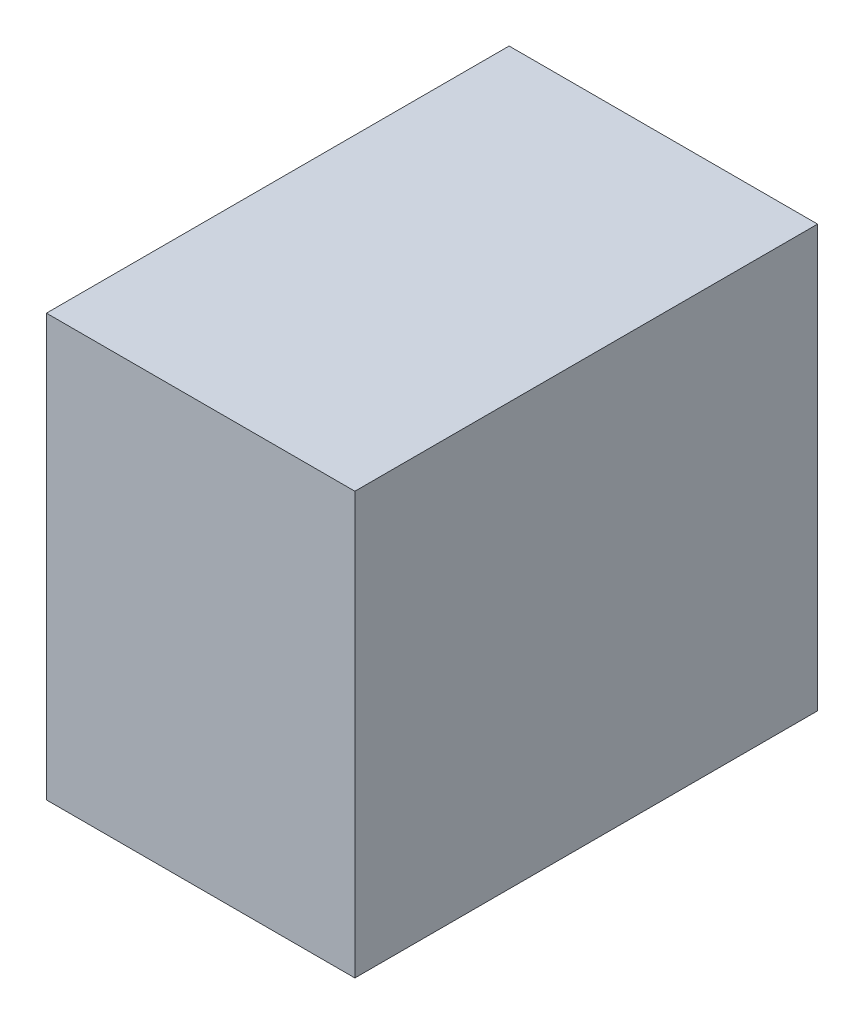
ISO-10303-21;
HEADER;
FILE_DESCRIPTION(('STEP AP214'),'2;1');
FILE_NAME('part.step','',(''),(''),'','','');
FILE_SCHEMA(('AUTOMOTIVE_DESIGN { 1 0 10303 214 1 1 1 1 }'));
ENDSEC;
DATA;
#1=APPLICATION_CONTEXT('core data for automotive mechanical design processes');
#2=APPLICATION_PROTOCOL_DEFINITION('international standard','automotive_design',2000,#1);
#3=PRODUCT_CONTEXT('',#1,'mechanical');
#4=PRODUCT('Part','Part','',(#3));
#5=PRODUCT_RELATED_PRODUCT_CATEGORY('part','',(#4));
#6=PRODUCT_DEFINITION_FORMATION('','',#4);
#7=PRODUCT_DEFINITION_CONTEXT('part definition',#1,'design');
#8=PRODUCT_DEFINITION('design','',#6,#7);
#9=PRODUCT_DEFINITION_SHAPE('','',#8);
#10=(LENGTH_UNIT() NAMED_UNIT(*) SI_UNIT(.MILLI.,.METRE.));
#11=(NAMED_UNIT(*) PLANE_ANGLE_UNIT() SI_UNIT($,.RADIAN.));
#12=(NAMED_UNIT(*) SI_UNIT($,.STERADIAN.) SOLID_ANGLE_UNIT());
#13=UNCERTAINTY_MEASURE_WITH_UNIT(LENGTH_MEASURE(1.E-05),#10,'distance_accuracy_value','');
#14=(GEOMETRIC_REPRESENTATION_CONTEXT(3) GLOBAL_UNCERTAINTY_ASSIGNED_CONTEXT((#13)) GLOBAL_UNIT_ASSIGNED_CONTEXT((#10,
#11,#12)) REPRESENTATION_CONTEXT('',''));
#15=CARTESIAN_POINT('',(0.,0.,0.));
#16=DIRECTION('',(0.,0.,1.));
#17=DIRECTION('',(1.,0.,0.));
#18=AXIS2_PLACEMENT_3D('',#15,#16,#17);
#19=CARTESIAN_POINT('',(-30.,-41.,90.));
#20=DIRECTION('',(1.,0.,0.));
#21=DIRECTION('',(0.,0.,-1.));
#22=AXIS2_PLACEMENT_3D('',#19,#20,#21);
#23=PLANE('',#22);
#24=DIRECTION('',(0.,-1.,0.));
#25=VECTOR('',#24,1.);
#26=CARTESIAN_POINT('',(-30.,-41.,0.));
#27=LINE('',#26,#25);
#28=CARTESIAN_POINT('',(-30.,41.,0.));
#29=VERTEX_POINT('',#28);
#30=CARTESIAN_POINT('',(-30.,-41.,0.));
#31=VERTEX_POINT('',#30);
#32=EDGE_CURVE('E106',#29,#31,#27,.T.);
#33=ORIENTED_EDGE('',*,*,#32,.T.);
#34=DIRECTION('',(0.,0.,-1.));
#35=VECTOR('',#34,1.);
#36=CARTESIAN_POINT('',(-30.,-41.,90.));
#37=LINE('',#36,#35);
#38=CARTESIAN_POINT('',(-30.,-41.,90.));
#39=VERTEX_POINT('',#38);
#40=EDGE_CURVE('E11',#39,#31,#37,.T.);
#41=ORIENTED_EDGE('',*,*,#40,.F.);
#42=DIRECTION('',(0.,-1.,0.));
#43=VECTOR('',#42,1.);
#44=CARTESIAN_POINT('',(-30.,-41.,90.));
#45=LINE('',#44,#43);
#46=CARTESIAN_POINT('',(-30.,41.,90.));
#47=VERTEX_POINT('',#46);
#48=EDGE_CURVE('E94',#47,#39,#45,.T.);
#49=ORIENTED_EDGE('',*,*,#48,.F.);
#50=DIRECTION('',(0.,0.,-1.));
#51=VECTOR('',#50,1.);
#52=CARTESIAN_POINT('',(-30.,41.,90.));
#53=LINE('',#52,#51);
#54=EDGE_CURVE('E102',#47,#29,#53,.T.);
#55=ORIENTED_EDGE('',*,*,#54,.T.);
#56=EDGE_LOOP('',(#33,#41,#49,#55));
#57=FACE_BOUND('',#56,.T.);
#58=ADVANCED_FACE('F43',(#57),#23,.F.);
#59=CARTESIAN_POINT('',(30.,-41.,90.));
#60=DIRECTION('',(0.,1.,0.));
#61=DIRECTION('',(-1.,0.,0.));
#62=AXIS2_PLACEMENT_3D('',#59,#60,#61);
#63=PLANE('',#62);
#64=DIRECTION('',(1.,0.,0.));
#65=VECTOR('',#64,1.);
#66=CARTESIAN_POINT('',(30.,-41.,0.));
#67=LINE('',#66,#65);
#68=CARTESIAN_POINT('',(30.,-41.,0.));
#69=VERTEX_POINT('',#68);
#70=EDGE_CURVE('E98',#31,#69,#67,.T.);
#71=ORIENTED_EDGE('',*,*,#70,.T.);
#72=DIRECTION('',(0.,0.,-1.));
#73=VECTOR('',#72,1.);
#74=CARTESIAN_POINT('',(30.,-41.,90.));
#75=LINE('',#74,#73);
#76=CARTESIAN_POINT('',(30.,-41.,90.));
#77=VERTEX_POINT('',#76);
#78=EDGE_CURVE('E51',#77,#69,#75,.T.);
#79=ORIENTED_EDGE('',*,*,#78,.F.);
#80=DIRECTION('',(1.,0.,0.));
#81=VECTOR('',#80,1.);
#82=CARTESIAN_POINT('',(30.,-41.,90.));
#83=LINE('',#82,#81);
#84=EDGE_CURVE('E89',#39,#77,#83,.T.);
#85=ORIENTED_EDGE('',*,*,#84,.F.);
#86=ORIENTED_EDGE('',*,*,#40,.T.);
#87=EDGE_LOOP('',(#71,#79,#85,#86));
#88=FACE_BOUND('',#87,.T.);
#89=ADVANCED_FACE('F97',(#88),#63,.F.);
#90=CARTESIAN_POINT('',(30.,-41.,90.));
#91=DIRECTION('',(-1.,0.,0.));
#92=DIRECTION('',(0.,0.,1.));
#93=AXIS2_PLACEMENT_3D('',#90,#91,#92);
#94=PLANE('',#93);
#95=DIRECTION('',(0.,1.,0.));
#96=VECTOR('',#95,1.);
#97=CARTESIAN_POINT('',(30.,-41.,0.));
#98=LINE('',#97,#96);
#99=CARTESIAN_POINT('',(30.,41.,0.));
#100=VERTEX_POINT('',#99);
#101=EDGE_CURVE('E76',#69,#100,#98,.T.);
#102=ORIENTED_EDGE('',*,*,#101,.T.);
#103=DIRECTION('',(0.,0.,-1.));
#104=VECTOR('',#103,1.);
#105=CARTESIAN_POINT('',(30.,41.,90.));
#106=LINE('',#105,#104);
#107=CARTESIAN_POINT('',(30.,41.,90.));
#108=VERTEX_POINT('',#107);
#109=EDGE_CURVE('E99',#108,#100,#106,.T.);
#110=ORIENTED_EDGE('',*,*,#109,.F.);
#111=DIRECTION('',(0.,1.,0.));
#112=VECTOR('',#111,1.);
#113=CARTESIAN_POINT('',(30.,-41.,90.));
#114=LINE('',#113,#112);
#115=EDGE_CURVE('E92',#77,#108,#114,.T.);
#116=ORIENTED_EDGE('',*,*,#115,.F.);
#117=ORIENTED_EDGE('',*,*,#78,.T.);
#118=EDGE_LOOP('',(#102,#110,#116,#117));
#119=FACE_BOUND('',#118,.T.);
#120=ADVANCED_FACE('F100',(#119),#94,.F.);
#121=CARTESIAN_POINT('',(30.,41.,90.));
#122=DIRECTION('',(0.,-1.,0.));
#123=DIRECTION('',(1.,0.,0.));
#124=AXIS2_PLACEMENT_3D('',#121,#122,#123);
#125=PLANE('',#124);
#126=DIRECTION('',(-1.,0.,0.));
#127=VECTOR('',#126,1.);
#128=CARTESIAN_POINT('',(30.,41.,0.));
#129=LINE('',#128,#127);
#130=EDGE_CURVE('E82',#100,#29,#129,.T.);
#131=ORIENTED_EDGE('',*,*,#130,.T.);
#132=ORIENTED_EDGE('',*,*,#54,.F.);
#133=DIRECTION('',(-1.,0.,0.));
#134=VECTOR('',#133,1.);
#135=CARTESIAN_POINT('',(30.,41.,90.));
#136=LINE('',#135,#134);
#137=EDGE_CURVE('E59',#108,#47,#136,.T.);
#138=ORIENTED_EDGE('',*,*,#137,.F.);
#139=ORIENTED_EDGE('',*,*,#109,.T.);
#140=EDGE_LOOP('',(#131,#132,#138,#139));
#141=FACE_BOUND('',#140,.T.);
#142=ADVANCED_FACE('F113',(#141),#125,.F.);
#143=CARTESIAN_POINT('',(0.,0.,90.));
#144=DIRECTION('',(0.,0.,1.));
#145=DIRECTION('',(1.,0.,0.));
#146=AXIS2_PLACEMENT_3D('',#143,#144,#145);
#147=PLANE('',#146);
#148=ORIENTED_EDGE('',*,*,#48,.T.);
#149=ORIENTED_EDGE('',*,*,#84,.T.);
#150=ORIENTED_EDGE('',*,*,#115,.T.);
#151=ORIENTED_EDGE('',*,*,#137,.T.);
#152=EDGE_LOOP('',(#148,#149,#150,#151));
#153=FACE_BOUND('',#152,.T.);
#154=ADVANCED_FACE('F90',(#153),#147,.T.);
#155=CARTESIAN_POINT('',(0.,0.,0.));
#156=DIRECTION('',(0.,0.,1.));
#157=DIRECTION('',(1.,0.,0.));
#158=AXIS2_PLACEMENT_3D('',#155,#156,#157);
#159=PLANE('',#158);
#160=ORIENTED_EDGE('',*,*,#32,.F.);
#161=ORIENTED_EDGE('',*,*,#130,.F.);
#162=ORIENTED_EDGE('',*,*,#101,.F.);
#163=ORIENTED_EDGE('',*,*,#70,.F.);
#164=EDGE_LOOP('',(#160,#161,#162,#163));
#165=FACE_BOUND('',#164,.T.);
#166=ADVANCED_FACE('F116',(#165),#159,.F.);
#167=CLOSED_SHELL('',(#58,#89,#120,#142,#154,#166));
#168=MANIFOLD_SOLID_BREP('B2',#167);
#169=ADVANCED_BREP_SHAPE_REPRESENTATION('',(#18,#168),#14);
#170=SHAPE_DEFINITION_REPRESENTATION(#9,#169);
ENDSEC;
END-ISO-10303-21;
